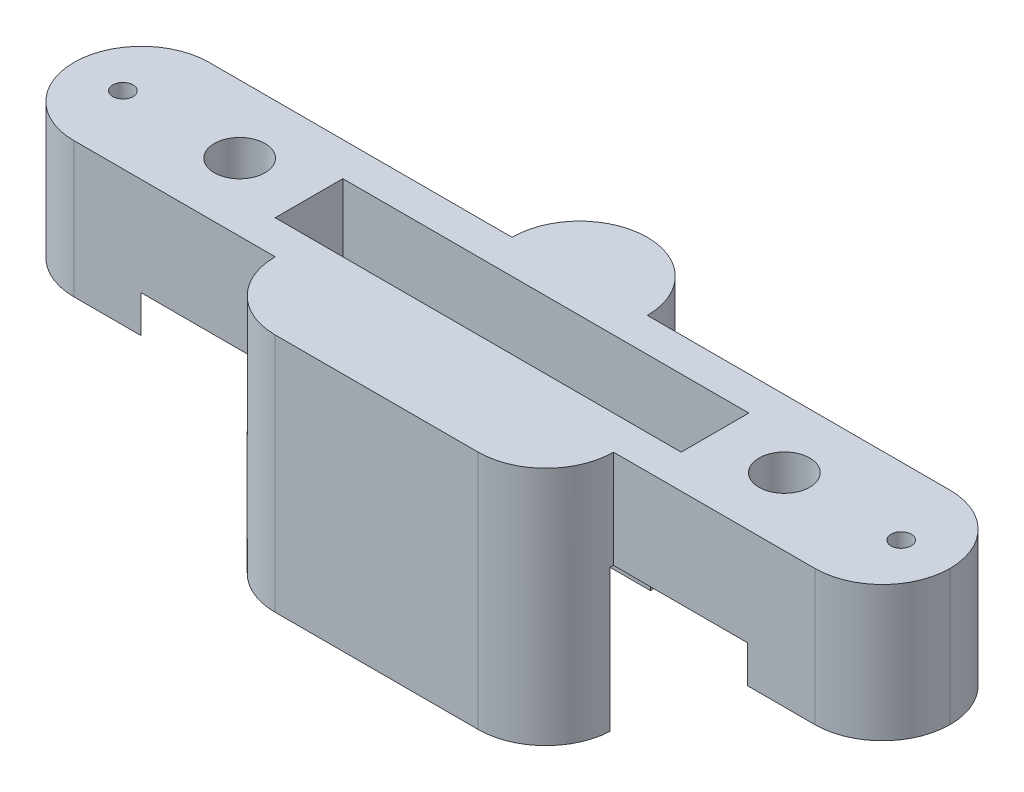
ISO-10303-21;
HEADER;
FILE_DESCRIPTION(('STEP AP214'),'2;1');
FILE_NAME('part.step','',(''),(''),'','','');
FILE_SCHEMA(('AUTOMOTIVE_DESIGN { 1 0 10303 214 1 1 1 1 }'));
ENDSEC;
DATA;
#1=APPLICATION_CONTEXT('core data for automotive mechanical design processes');
#2=APPLICATION_PROTOCOL_DEFINITION('international standard','automotive_design',2000,#1);
#3=PRODUCT_CONTEXT('',#1,'mechanical');
#4=PRODUCT('Part','Part','',(#3));
#5=PRODUCT_RELATED_PRODUCT_CATEGORY('part','',(#4));
#6=PRODUCT_DEFINITION_FORMATION('','',#4);
#7=PRODUCT_DEFINITION_CONTEXT('part definition',#1,'design');
#8=PRODUCT_DEFINITION('design','',#6,#7);
#9=PRODUCT_DEFINITION_SHAPE('','',#8);
#10=(LENGTH_UNIT() NAMED_UNIT(*) SI_UNIT(.MILLI.,.METRE.));
#11=(NAMED_UNIT(*) PLANE_ANGLE_UNIT() SI_UNIT($,.RADIAN.));
#12=(NAMED_UNIT(*) SI_UNIT($,.STERADIAN.) SOLID_ANGLE_UNIT());
#13=UNCERTAINTY_MEASURE_WITH_UNIT(LENGTH_MEASURE(1.E-05),#10,'distance_accuracy_value','');
#14=(GEOMETRIC_REPRESENTATION_CONTEXT(3) GLOBAL_UNCERTAINTY_ASSIGNED_CONTEXT((#13)) GLOBAL_UNIT_ASSIGNED_CONTEXT((#10,
#11,#12)) REPRESENTATION_CONTEXT('',''));
#15=CARTESIAN_POINT('',(0.,0.,0.));
#16=DIRECTION('',(0.,0.,1.));
#17=DIRECTION('',(1.,0.,0.));
#18=AXIS2_PLACEMENT_3D('',#15,#16,#17);
#19=CARTESIAN_POINT('',(-10.05,2.1,-2.));
#20=DIRECTION('',(0.,0.,-1.));
#21=DIRECTION('',(-1.,0.,0.));
#22=AXIS2_PLACEMENT_3D('',#19,#20,#21);
#23=PLANE('',#22);
#24=DIRECTION('',(0.,-1.,0.));
#25=VECTOR('',#24,1.);
#26=CARTESIAN_POINT('',(-2.,10.1980390271856,-2.));
#27=LINE('',#26,#25);
#28=CARTESIAN_POINT('',(-2.,0.,-2.));
#29=VERTEX_POINT('',#28);
#30=CARTESIAN_POINT('',(-2.,-2.9,-2.));
#31=VERTEX_POINT('',#30);
#32=EDGE_CURVE('E280',#29,#31,#27,.T.);
#33=ORIENTED_EDGE('',*,*,#32,.T.);
#34=DIRECTION('',(1.,0.,0.));
#35=VECTOR('',#34,1.);
#36=CARTESIAN_POINT('',(-8.05,-2.9,-2.));
#37=LINE('',#36,#35);
#38=CARTESIAN_POINT('',(-8.96651513899117,-2.9,-2.));
#39=VERTEX_POINT('',#38);
#40=EDGE_CURVE('E322',#39,#31,#37,.T.);
#41=ORIENTED_EDGE('',*,*,#40,.F.);
#42=DIRECTION('',(0.,-1.,0.));
#43=VECTOR('',#42,1.);
#44=CARTESIAN_POINT('',(-8.96651513899117,3.32253967444162,-2.));
#45=LINE('',#44,#43);
#46=CARTESIAN_POINT('',(-8.96651513899117,-4.,-2.));
#47=VERTEX_POINT('',#46);
#48=EDGE_CURVE('E302',#47,#39,#45,.F.);
#49=ORIENTED_EDGE('',*,*,#48,.F.);
#50=DIRECTION('',(1.,0.,0.));
#51=VECTOR('',#50,1.);
#52=CARTESIAN_POINT('',(-12.95,-4.,-2.));
#53=LINE('',#52,#51);
#54=CARTESIAN_POINT('',(-10.95,-4.,-2.));
#55=VERTEX_POINT('',#54);
#56=EDGE_CURVE('E340',#55,#47,#53,.T.);
#57=ORIENTED_EDGE('',*,*,#56,.F.);
#58=DIRECTION('',(0.,1.,0.));
#59=VECTOR('',#58,1.);
#60=CARTESIAN_POINT('',(-10.95,0.,-2.));
#61=LINE('',#60,#59);
#62=CARTESIAN_POINT('',(-10.95,0.,-2.));
#63=VERTEX_POINT('',#62);
#64=EDGE_CURVE('E367',#55,#63,#61,.T.);
#65=ORIENTED_EDGE('',*,*,#64,.T.);
#66=DIRECTION('',(1.,0.,0.));
#67=VECTOR('',#66,1.);
#68=CARTESIAN_POINT('',(-12.95,0.,-2.));
#69=LINE('',#68,#67);
#70=EDGE_CURVE('E349',#63,#29,#69,.T.);
#71=ORIENTED_EDGE('',*,*,#70,.T.);
#72=EDGE_LOOP('',(#33,#41,#49,#57,#65,#71));
#73=FACE_BOUND('',#72,.T.);
#74=ADVANCED_FACE('F41',(#73),#23,.T.);
#75=CARTESIAN_POINT('',(-10.05,2.1,2.));
#76=DIRECTION('',(0.,0.,-1.));
#77=DIRECTION('',(-1.,0.,0.));
#78=AXIS2_PLACEMENT_3D('',#75,#76,#77);
#79=PLANE('',#78);
#80=DIRECTION('',(-1.,0.,0.));
#81=VECTOR('',#80,1.);
#82=CARTESIAN_POINT('',(8.05,-2.9,2.));
#83=LINE('',#82,#81);
#84=CARTESIAN_POINT('',(-5.,-2.9,2.));
#85=VERTEX_POINT('',#84);
#86=CARTESIAN_POINT('',(-8.96651513899117,-2.9,2.));
#87=VERTEX_POINT('',#86);
#88=EDGE_CURVE('E321',#85,#87,#83,.T.);
#89=ORIENTED_EDGE('',*,*,#88,.F.);
#90=DIRECTION('',(0.,-1.,0.));
#91=VECTOR('',#90,1.);
#92=CARTESIAN_POINT('',(-5.,10.1980390271856,2.));
#93=LINE('',#92,#91);
#94=CARTESIAN_POINT('',(-5.,0.,2.));
#95=VERTEX_POINT('',#94);
#96=EDGE_CURVE('E289',#95,#85,#93,.T.);
#97=ORIENTED_EDGE('',*,*,#96,.F.);
#98=DIRECTION('',(1.,0.,0.));
#99=VECTOR('',#98,1.);
#100=CARTESIAN_POINT('',(-12.95,0.,2.));
#101=LINE('',#100,#99);
#102=CARTESIAN_POINT('',(-10.95,0.,2.));
#103=VERTEX_POINT('',#102);
#104=EDGE_CURVE('E344',#103,#95,#101,.T.);
#105=ORIENTED_EDGE('',*,*,#104,.F.);
#106=DIRECTION('',(0.,1.,0.));
#107=VECTOR('',#106,1.);
#108=CARTESIAN_POINT('',(-10.95,2.1,2.));
#109=LINE('',#108,#107);
#110=CARTESIAN_POINT('',(-10.95,-4.,2.));
#111=VERTEX_POINT('',#110);
#112=EDGE_CURVE('E343',#103,#111,#109,.F.);
#113=ORIENTED_EDGE('',*,*,#112,.T.);
#114=DIRECTION('',(1.,0.,0.));
#115=VECTOR('',#114,1.);
#116=CARTESIAN_POINT('',(-12.95,-4.,2.));
#117=LINE('',#116,#115);
#118=CARTESIAN_POINT('',(-8.96651513899117,-4.,2.));
#119=VERTEX_POINT('',#118);
#120=EDGE_CURVE('E335',#111,#119,#117,.T.);
#121=ORIENTED_EDGE('',*,*,#120,.T.);
#122=DIRECTION('',(0.,-1.,0.));
#123=VECTOR('',#122,1.);
#124=CARTESIAN_POINT('',(-8.96651513899117,3.32253967444162,2.));
#125=LINE('',#124,#123);
#126=EDGE_CURVE('E308',#119,#87,#125,.F.);
#127=ORIENTED_EDGE('',*,*,#126,.T.);
#128=EDGE_LOOP('',(#89,#97,#105,#113,#121,#127));
#129=FACE_BOUND('',#128,.T.);
#130=ADVANCED_FACE('F464',(#129),#79,.F.);
#131=CARTESIAN_POINT('',(5.,0.,2.));
#132=VERTEX_POINT('',#131);
#133=CARTESIAN_POINT('',(10.95,0.,2.));
#134=VERTEX_POINT('',#133);
#135=EDGE_CURVE('E348',#132,#134,#101,.T.);
#136=ORIENTED_EDGE('',*,*,#135,.F.);
#137=DIRECTION('',(0.,-1.,0.));
#138=VECTOR('',#137,1.);
#139=CARTESIAN_POINT('',(5.,10.1980390271856,2.));
#140=LINE('',#139,#138);
#141=CARTESIAN_POINT('',(5.,-2.9,2.));
#142=VERTEX_POINT('',#141);
#143=EDGE_CURVE('E290',#132,#142,#140,.T.);
#144=ORIENTED_EDGE('',*,*,#143,.T.);
#145=CARTESIAN_POINT('',(8.96651513899117,-2.9,2.));
#146=VERTEX_POINT('',#145);
#147=EDGE_CURVE('E317',#146,#142,#83,.T.);
#148=ORIENTED_EDGE('',*,*,#147,.F.);
#149=DIRECTION('',(0.,-1.,0.));
#150=VECTOR('',#149,1.);
#151=CARTESIAN_POINT('',(8.96651513899117,3.32253967444162,2.));
#152=LINE('',#151,#150);
#153=CARTESIAN_POINT('',(8.96651513899117,-4.,2.));
#154=VERTEX_POINT('',#153);
#155=EDGE_CURVE('E313',#146,#154,#152,.T.);
#156=ORIENTED_EDGE('',*,*,#155,.T.);
#157=CARTESIAN_POINT('',(10.95,-4.,2.));
#158=VERTEX_POINT('',#157);
#159=EDGE_CURVE('E339',#154,#158,#117,.T.);
#160=ORIENTED_EDGE('',*,*,#159,.T.);
#161=DIRECTION('',(0.,1.,0.));
#162=VECTOR('',#161,1.);
#163=CARTESIAN_POINT('',(10.95,0.,2.));
#164=LINE('',#163,#162);
#165=EDGE_CURVE('E354',#158,#134,#164,.T.);
#166=ORIENTED_EDGE('',*,*,#165,.T.);
#167=EDGE_LOOP('',(#136,#144,#148,#156,#160,#166));
#168=FACE_BOUND('',#167,.T.);
#169=ADVANCED_FACE('F522',(#168),#79,.F.);
#170=DIRECTION('',(0.,-1.,0.));
#171=VECTOR('',#170,1.);
#172=CARTESIAN_POINT('',(2.,10.1980390271856,-2.));
#173=LINE('',#172,#171);
#174=CARTESIAN_POINT('',(2.,0.,-2.));
#175=VERTEX_POINT('',#174);
#176=CARTESIAN_POINT('',(2.,-2.9,-2.));
#177=VERTEX_POINT('',#176);
#178=EDGE_CURVE('E277',#175,#177,#173,.T.);
#179=ORIENTED_EDGE('',*,*,#178,.F.);
#180=CARTESIAN_POINT('',(10.95,0.,-2.));
#181=VERTEX_POINT('',#180);
#182=EDGE_CURVE('E347',#175,#181,#69,.T.);
#183=ORIENTED_EDGE('',*,*,#182,.T.);
#184=DIRECTION('',(0.,1.,0.));
#185=VECTOR('',#184,1.);
#186=CARTESIAN_POINT('',(10.95,2.1,-2.));
#187=LINE('',#186,#185);
#188=CARTESIAN_POINT('',(10.95,-4.,-2.));
#189=VERTEX_POINT('',#188);
#190=EDGE_CURVE('E370',#181,#189,#187,.F.);
#191=ORIENTED_EDGE('',*,*,#190,.T.);
#192=CARTESIAN_POINT('',(8.96651513899117,-4.,-2.));
#193=VERTEX_POINT('',#192);
#194=EDGE_CURVE('E338',#193,#189,#53,.T.);
#195=ORIENTED_EDGE('',*,*,#194,.F.);
#196=DIRECTION('',(0.,-1.,0.));
#197=VECTOR('',#196,1.);
#198=CARTESIAN_POINT('',(8.96651513899117,3.32253967444162,-2.));
#199=LINE('',#198,#197);
#200=CARTESIAN_POINT('',(8.96651513899117,-2.9,-2.));
#201=VERTEX_POINT('',#200);
#202=EDGE_CURVE('E311',#201,#193,#199,.T.);
#203=ORIENTED_EDGE('',*,*,#202,.F.);
#204=EDGE_CURVE('E316',#177,#201,#37,.T.);
#205=ORIENTED_EDGE('',*,*,#204,.F.);
#206=EDGE_LOOP('',(#179,#183,#191,#195,#203,#205));
#207=FACE_BOUND('',#206,.T.);
#208=ADVANCED_FACE('F509',(#207),#23,.T.);
#209=CARTESIAN_POINT('',(0.,-4.,0.));
#210=DIRECTION('',(0.,1.,0.));
#211=DIRECTION('',(0.,0.,1.));
#212=AXIS2_PLACEMENT_3D('',#209,#210,#211);
#213=PLANE('',#212);
#214=CARTESIAN_POINT('',(-11.5,-4.,0.));
#215=DIRECTION('',(0.,-1.,0.));
#216=DIRECTION('',(0.,0.,-1.));
#217=AXIS2_PLACEMENT_3D('',#214,#215,#216);
#218=CIRCLE('',#217,0.3);
#219=CARTESIAN_POINT('',(-11.5,-4.,-0.3));
#220=VERTEX_POINT('',#219);
#221=EDGE_CURVE('E325',#220,#220,#218,.T.);
#222=ORIENTED_EDGE('',*,*,#221,.F.);
#223=EDGE_LOOP('',(#222));
#224=FACE_BOUND('',#223,.T.);
#225=ORIENTED_EDGE('',*,*,#56,.T.);
#226=CARTESIAN_POINT('',(-8.05,-4.,0.));
#227=DIRECTION('',(0.,-1.,0.));
#228=DIRECTION('',(0.,0.,-1.));
#229=AXIS2_PLACEMENT_3D('',#226,#227,#228);
#230=CIRCLE('',#229,2.2);
#231=EDGE_CURVE('E299',#119,#47,#230,.T.);
#232=ORIENTED_EDGE('',*,*,#231,.F.);
#233=ORIENTED_EDGE('',*,*,#120,.F.);
#234=CARTESIAN_POINT('',(-10.95,-4.,0.));
#235=DIRECTION('',(0.,1.,0.));
#236=DIRECTION('',(0.,0.,1.));
#237=AXIS2_PLACEMENT_3D('',#234,#235,#236);
#238=CIRCLE('',#237,2.);
#239=CARTESIAN_POINT('',(-12.95,-4.,0.));
#240=VERTEX_POINT('',#239);
#241=EDGE_CURVE('E380',#111,#240,#238,.F.);
#242=ORIENTED_EDGE('',*,*,#241,.T.);
#243=CARTESIAN_POINT('',(-10.95,-4.,0.));
#244=DIRECTION('',(0.,1.,0.));
#245=DIRECTION('',(0.,0.,1.));
#246=AXIS2_PLACEMENT_3D('',#243,#244,#245);
#247=CIRCLE('',#246,2.);
#248=EDGE_CURVE('E378',#240,#55,#247,.F.);
#249=ORIENTED_EDGE('',*,*,#248,.T.);
#250=EDGE_LOOP('',(#225,#232,#233,#242,#249));
#251=FACE_BOUND('',#250,.T.);
#252=ADVANCED_FACE('F477',(#224,#251),#213,.F.);
#253=CARTESIAN_POINT('',(0.,0.,0.));
#254=DIRECTION('',(0.,1.,0.));
#255=DIRECTION('',(0.,0.,1.));
#256=AXIS2_PLACEMENT_3D('',#253,#254,#255);
#257=PLANE('',#256);
#258=DIRECTION('',(0.,0.,-1.));
#259=VECTOR('',#258,1.);
#260=CARTESIAN_POINT('',(-6.,0.,1.));
#261=LINE('',#260,#259);
#262=CARTESIAN_POINT('',(-6.,0.,1.));
#263=VERTEX_POINT('',#262);
#264=CARTESIAN_POINT('',(-6.,0.,-1.));
#265=VERTEX_POINT('',#264);
#266=EDGE_CURVE('E211',#263,#265,#261,.T.);
#267=ORIENTED_EDGE('',*,*,#266,.T.);
#268=DIRECTION('',(1.,0.,0.));
#269=VECTOR('',#268,1.);
#270=CARTESIAN_POINT('',(-6.,0.,-1.));
#271=LINE('',#270,#269);
#272=CARTESIAN_POINT('',(6.,0.,-1.));
#273=VERTEX_POINT('',#272);
#274=EDGE_CURVE('E220',#265,#273,#271,.T.);
#275=ORIENTED_EDGE('',*,*,#274,.T.);
#276=DIRECTION('',(0.,0.,1.));
#277=VECTOR('',#276,1.);
#278=CARTESIAN_POINT('',(6.,0.,1.));
#279=LINE('',#278,#277);
#280=CARTESIAN_POINT('',(6.,0.,1.));
#281=VERTEX_POINT('',#280);
#282=EDGE_CURVE('E58',#273,#281,#279,.T.);
#283=ORIENTED_EDGE('',*,*,#282,.T.);
#284=DIRECTION('',(-1.,0.,0.));
#285=VECTOR('',#284,1.);
#286=CARTESIAN_POINT('',(-6.,0.,1.));
#287=LINE('',#286,#285);
#288=EDGE_CURVE('E217',#281,#263,#287,.T.);
#289=ORIENTED_EDGE('',*,*,#288,.T.);
#290=EDGE_LOOP('',(#267,#275,#283,#289));
#291=FACE_BOUND('',#290,.T.);
#292=CARTESIAN_POINT('',(-8.05,0.,0.));
#293=DIRECTION('',(0.,-1.,0.));
#294=DIRECTION('',(0.,0.,-1.));
#295=AXIS2_PLACEMENT_3D('',#292,#293,#294);
#296=CIRCLE('',#295,0.75);
#297=CARTESIAN_POINT('',(-8.05,0.,-0.75));
#298=VERTEX_POINT('',#297);
#299=EDGE_CURVE('E246',#298,#298,#296,.T.);
#300=ORIENTED_EDGE('',*,*,#299,.T.);
#301=EDGE_LOOP('',(#300));
#302=FACE_BOUND('',#301,.T.);
#303=CARTESIAN_POINT('',(8.05,0.,0.));
#304=DIRECTION('',(0.,-1.,0.));
#305=DIRECTION('',(0.,0.,-1.));
#306=AXIS2_PLACEMENT_3D('',#303,#304,#305);
#307=CIRCLE('',#306,0.75);
#308=CARTESIAN_POINT('',(8.05,0.,-0.750000000000001));
#309=VERTEX_POINT('',#308);
#310=EDGE_CURVE('E242',#309,#309,#307,.T.);
#311=ORIENTED_EDGE('',*,*,#310,.T.);
#312=EDGE_LOOP('',(#311));
#313=FACE_BOUND('',#312,.T.);
#314=ORIENTED_EDGE('',*,*,#104,.T.);
#315=CARTESIAN_POINT('',(-3.,0.,2.));
#316=DIRECTION('',(0.,1.,0.));
#317=DIRECTION('',(0.,0.,1.));
#318=AXIS2_PLACEMENT_3D('',#315,#316,#317);
#319=CIRCLE('',#318,2.);
#320=CARTESIAN_POINT('',(-3.,0.,4.));
#321=VERTEX_POINT('',#320);
#322=EDGE_CURVE('E12',#95,#321,#319,.T.);
#323=ORIENTED_EDGE('',*,*,#322,.T.);
#324=DIRECTION('',(-1.,0.,0.));
#325=VECTOR('',#324,1.);
#326=CARTESIAN_POINT('',(5.,0.,4.));
#327=LINE('',#326,#325);
#328=CARTESIAN_POINT('',(3.,0.,4.));
#329=VERTEX_POINT('',#328);
#330=EDGE_CURVE('E286',#329,#321,#327,.T.);
#331=ORIENTED_EDGE('',*,*,#330,.F.);
#332=CARTESIAN_POINT('',(3.,0.,2.));
#333=DIRECTION('',(0.,1.,0.));
#334=DIRECTION('',(0.,0.,1.));
#335=AXIS2_PLACEMENT_3D('',#332,#333,#334);
#336=CIRCLE('',#335,2.);
#337=EDGE_CURVE('E50',#329,#132,#336,.T.);
#338=ORIENTED_EDGE('',*,*,#337,.T.);
#339=ORIENTED_EDGE('',*,*,#135,.T.);
#340=CARTESIAN_POINT('',(10.95,0.,0.));
#341=DIRECTION('',(0.,1.,0.));
#342=DIRECTION('',(0.,0.,1.));
#343=AXIS2_PLACEMENT_3D('',#340,#341,#342);
#344=CIRCLE('',#343,2.);
#345=CARTESIAN_POINT('',(12.95,0.,0.));
#346=VERTEX_POINT('',#345);
#347=EDGE_CURVE('E360',#134,#346,#344,.T.);
#348=ORIENTED_EDGE('',*,*,#347,.T.);
#349=CARTESIAN_POINT('',(10.95,0.,0.));
#350=DIRECTION('',(0.,1.,0.));
#351=DIRECTION('',(0.,0.,1.));
#352=AXIS2_PLACEMENT_3D('',#349,#350,#351);
#353=CIRCLE('',#352,2.);
#354=EDGE_CURVE('E357',#346,#181,#353,.T.);
#355=ORIENTED_EDGE('',*,*,#354,.T.);
#356=ORIENTED_EDGE('',*,*,#182,.F.);
#357=CARTESIAN_POINT('',(0.,0.,-2.));
#358=DIRECTION('',(0.,1.,0.));
#359=DIRECTION('',(0.,0.,1.));
#360=AXIS2_PLACEMENT_3D('',#357,#358,#359);
#361=CIRCLE('',#360,2.);
#362=CARTESIAN_POINT('',(0.,0.,-4.));
#363=VERTEX_POINT('',#362);
#364=EDGE_CURVE('E401',#175,#363,#361,.T.);
#365=ORIENTED_EDGE('',*,*,#364,.T.);
#366=CARTESIAN_POINT('',(0.,0.,-2.));
#367=DIRECTION('',(0.,1.,0.));
#368=DIRECTION('',(0.,0.,1.));
#369=AXIS2_PLACEMENT_3D('',#366,#367,#368);
#370=CIRCLE('',#369,2.);
#371=EDGE_CURVE('E403',#363,#29,#370,.T.);
#372=ORIENTED_EDGE('',*,*,#371,.T.);
#373=ORIENTED_EDGE('',*,*,#70,.F.);
#374=CARTESIAN_POINT('',(-10.95,0.,0.));
#375=DIRECTION('',(0.,1.,0.));
#376=DIRECTION('',(0.,0.,1.));
#377=AXIS2_PLACEMENT_3D('',#374,#375,#376);
#378=CIRCLE('',#377,2.);
#379=CARTESIAN_POINT('',(-12.95,0.,0.));
#380=VERTEX_POINT('',#379);
#381=EDGE_CURVE('E373',#63,#380,#378,.T.);
#382=ORIENTED_EDGE('',*,*,#381,.T.);
#383=CARTESIAN_POINT('',(-10.95,0.,0.));
#384=DIRECTION('',(0.,1.,0.));
#385=DIRECTION('',(0.,0.,1.));
#386=AXIS2_PLACEMENT_3D('',#383,#384,#385);
#387=CIRCLE('',#386,2.);
#388=EDGE_CURVE('E375',#380,#103,#387,.T.);
#389=ORIENTED_EDGE('',*,*,#388,.T.);
#390=EDGE_LOOP('',(#314,#323,#331,#338,#339,#348,#355,#356,#365,#372,#373,#382,#389));
#391=FACE_BOUND('',#390,.T.);
#392=CARTESIAN_POINT('',(11.5,0.,0.));
#393=DIRECTION('',(0.,1.,0.));
#394=DIRECTION('',(0.,0.,1.));
#395=AXIS2_PLACEMENT_3D('',#392,#393,#394);
#396=CIRCLE('',#395,0.3);
#397=CARTESIAN_POINT('',(11.5,0.,0.3));
#398=VERTEX_POINT('',#397);
#399=EDGE_CURVE('E331',#398,#398,#396,.T.);
#400=ORIENTED_EDGE('',*,*,#399,.F.);
#401=EDGE_LOOP('',(#400));
#402=FACE_BOUND('',#401,.T.);
#403=CARTESIAN_POINT('',(-11.5,0.,0.));
#404=DIRECTION('',(0.,1.,0.));
#405=DIRECTION('',(0.,0.,1.));
#406=AXIS2_PLACEMENT_3D('',#403,#404,#405);
#407=CIRCLE('',#406,0.3);
#408=CARTESIAN_POINT('',(-11.5,0.,0.3));
#409=VERTEX_POINT('',#408);
#410=EDGE_CURVE('E328',#409,#409,#407,.T.);
#411=ORIENTED_EDGE('',*,*,#410,.F.);
#412=EDGE_LOOP('',(#411));
#413=FACE_BOUND('',#412,.T.);
#414=ADVANCED_FACE('F224',(#291,#302,#313,#391,#402,#413),#257,.T.);
#415=CARTESIAN_POINT('',(11.5,-4.,0.));
#416=DIRECTION('',(0.,-1.,0.));
#417=DIRECTION('',(0.,0.,-1.));
#418=AXIS2_PLACEMENT_3D('',#415,#416,#417);
#419=CIRCLE('',#418,0.3);
#420=CARTESIAN_POINT('',(11.5,-4.,-0.3));
#421=VERTEX_POINT('',#420);
#422=EDGE_CURVE('E320',#421,#421,#419,.T.);
#423=ORIENTED_EDGE('',*,*,#422,.F.);
#424=EDGE_LOOP('',(#423));
#425=FACE_BOUND('',#424,.T.);
#426=ORIENTED_EDGE('',*,*,#159,.F.);
#427=CARTESIAN_POINT('',(8.05,-4.,0.));
#428=DIRECTION('',(0.,-1.,0.));
#429=DIRECTION('',(0.,0.,-1.));
#430=AXIS2_PLACEMENT_3D('',#427,#428,#429);
#431=CIRCLE('',#430,2.2);
#432=EDGE_CURVE('E296',#193,#154,#431,.T.);
#433=ORIENTED_EDGE('',*,*,#432,.F.);
#434=ORIENTED_EDGE('',*,*,#194,.T.);
#435=CARTESIAN_POINT('',(10.95,-4.,0.));
#436=DIRECTION('',(0.,1.,0.));
#437=DIRECTION('',(0.,0.,1.));
#438=AXIS2_PLACEMENT_3D('',#435,#436,#437);
#439=CIRCLE('',#438,2.);
#440=CARTESIAN_POINT('',(12.95,-4.,0.));
#441=VERTEX_POINT('',#440);
#442=EDGE_CURVE('E362',#189,#441,#439,.F.);
#443=ORIENTED_EDGE('',*,*,#442,.T.);
#444=CARTESIAN_POINT('',(10.95,-4.,0.));
#445=DIRECTION('',(0.,1.,0.));
#446=DIRECTION('',(0.,0.,1.));
#447=AXIS2_PLACEMENT_3D('',#444,#445,#446);
#448=CIRCLE('',#447,2.);
#449=EDGE_CURVE('E364',#441,#158,#448,.F.);
#450=ORIENTED_EDGE('',*,*,#449,.T.);
#451=EDGE_LOOP('',(#426,#433,#434,#443,#450));
#452=FACE_BOUND('',#451,.T.);
#453=ADVANCED_FACE('F517',(#425,#452),#213,.F.);
#454=CARTESIAN_POINT('',(10.95,-4.,0.));
#455=DIRECTION('',(0.,1.,0.));
#456=DIRECTION('',(0.,0.,1.));
#457=AXIS2_PLACEMENT_3D('',#454,#455,#456);
#458=CYLINDRICAL_SURFACE('',#457,2.);
#459=DIRECTION('',(0.,1.,0.));
#460=VECTOR('',#459,1.);
#461=CARTESIAN_POINT('',(12.95,-4.,0.));
#462=LINE('',#461,#460);
#463=EDGE_CURVE('E383',#441,#346,#462,.T.);
#464=ORIENTED_EDGE('',*,*,#463,.F.);
#465=ORIENTED_EDGE('',*,*,#442,.F.);
#466=ORIENTED_EDGE('',*,*,#190,.F.);
#467=ORIENTED_EDGE('',*,*,#354,.F.);
#468=EDGE_LOOP('',(#464,#465,#466,#467));
#469=FACE_BOUND('',#468,.T.);
#470=ADVANCED_FACE('F542',(#469),#458,.T.);
#471=CARTESIAN_POINT('',(10.95,2.1,0.));
#472=DIRECTION('',(0.,-1.,0.));
#473=DIRECTION('',(0.,0.,-1.));
#474=AXIS2_PLACEMENT_3D('',#471,#472,#473);
#475=CYLINDRICAL_SURFACE('',#474,2.);
#476=ORIENTED_EDGE('',*,*,#449,.F.);
#477=ORIENTED_EDGE('',*,*,#463,.T.);
#478=ORIENTED_EDGE('',*,*,#347,.F.);
#479=ORIENTED_EDGE('',*,*,#165,.F.);
#480=EDGE_LOOP('',(#476,#477,#478,#479));
#481=FACE_BOUND('',#480,.T.);
#482=ADVANCED_FACE('F538',(#481),#475,.T.);
#483=CARTESIAN_POINT('',(-10.95,2.1,0.));
#484=DIRECTION('',(0.,-1.,0.));
#485=DIRECTION('',(0.,0.,-1.));
#486=AXIS2_PLACEMENT_3D('',#483,#484,#485);
#487=CYLINDRICAL_SURFACE('',#486,2.);
#488=ORIENTED_EDGE('',*,*,#64,.F.);
#489=ORIENTED_EDGE('',*,*,#248,.F.);
#490=DIRECTION('',(0.,1.,0.));
#491=VECTOR('',#490,1.);
#492=CARTESIAN_POINT('',(-12.95,-4.,0.));
#493=LINE('',#492,#491);
#494=EDGE_CURVE('E334',#380,#240,#493,.F.);
#495=ORIENTED_EDGE('',*,*,#494,.F.);
#496=ORIENTED_EDGE('',*,*,#381,.F.);
#497=EDGE_LOOP('',(#488,#489,#495,#496));
#498=FACE_BOUND('',#497,.T.);
#499=ADVANCED_FACE('F545',(#498),#487,.T.);
#500=CARTESIAN_POINT('',(-10.95,-4.,0.));
#501=DIRECTION('',(0.,1.,0.));
#502=DIRECTION('',(0.,0.,1.));
#503=AXIS2_PLACEMENT_3D('',#500,#501,#502);
#504=CYLINDRICAL_SURFACE('',#503,2.);
#505=ORIENTED_EDGE('',*,*,#241,.F.);
#506=ORIENTED_EDGE('',*,*,#112,.F.);
#507=ORIENTED_EDGE('',*,*,#388,.F.);
#508=ORIENTED_EDGE('',*,*,#494,.T.);
#509=EDGE_LOOP('',(#505,#506,#507,#508));
#510=FACE_BOUND('',#509,.T.);
#511=ADVANCED_FACE('F473',(#510),#504,.T.);
#512=CARTESIAN_POINT('',(-11.5,2.1,0.));
#513=DIRECTION('',(0.,-1.,0.));
#514=DIRECTION('',(0.,0.,-1.));
#515=AXIS2_PLACEMENT_3D('',#512,#513,#514);
#516=CYLINDRICAL_SURFACE('',#515,0.3);
#517=ORIENTED_EDGE('',*,*,#410,.T.);
#518=EDGE_LOOP('',(#517));
#519=FACE_BOUND('',#518,.T.);
#520=ORIENTED_EDGE('',*,*,#221,.T.);
#521=EDGE_LOOP('',(#520));
#522=FACE_BOUND('',#521,.T.);
#523=ADVANCED_FACE('F552',(#519,#522),#516,.F.);
#524=CARTESIAN_POINT('',(11.5,2.1,0.));
#525=DIRECTION('',(0.,-1.,0.));
#526=DIRECTION('',(0.,0.,-1.));
#527=AXIS2_PLACEMENT_3D('',#524,#525,#526);
#528=CYLINDRICAL_SURFACE('',#527,0.3);
#529=ORIENTED_EDGE('',*,*,#399,.T.);
#530=EDGE_LOOP('',(#529));
#531=FACE_BOUND('',#530,.T.);
#532=ORIENTED_EDGE('',*,*,#422,.T.);
#533=EDGE_LOOP('',(#532));
#534=FACE_BOUND('',#533,.T.);
#535=ADVANCED_FACE('F450',(#531,#534),#528,.F.);
#536=CARTESIAN_POINT('',(0.,-2.9,0.));
#537=DIRECTION('',(0.,1.,0.));
#538=DIRECTION('',(0.,0.,1.));
#539=AXIS2_PLACEMENT_3D('',#536,#537,#538);
#540=PLANE('',#539);
#541=DIRECTION('',(1.,0.,0.));
#542=VECTOR('',#541,1.);
#543=CARTESIAN_POINT('',(-6.,-2.9,-1.));
#544=LINE('',#543,#542);
#545=CARTESIAN_POINT('',(-6.,-2.9,-1.));
#546=VERTEX_POINT('',#545);
#547=CARTESIAN_POINT('',(6.,-2.9,-1.));
#548=VERTEX_POINT('',#547);
#549=EDGE_CURVE('E236',#546,#548,#544,.T.);
#550=ORIENTED_EDGE('',*,*,#549,.F.);
#551=DIRECTION('',(0.,0.,-1.));
#552=VECTOR('',#551,1.);
#553=CARTESIAN_POINT('',(-6.,-2.9,1.));
#554=LINE('',#553,#552);
#555=CARTESIAN_POINT('',(-6.,-2.9,1.));
#556=VERTEX_POINT('',#555);
#557=EDGE_CURVE('E66',#556,#546,#554,.T.);
#558=ORIENTED_EDGE('',*,*,#557,.F.);
#559=DIRECTION('',(-1.,0.,0.));
#560=VECTOR('',#559,1.);
#561=CARTESIAN_POINT('',(-6.,-2.9,1.));
#562=LINE('',#561,#560);
#563=CARTESIAN_POINT('',(6.,-2.9,1.));
#564=VERTEX_POINT('',#563);
#565=EDGE_CURVE('E227',#564,#556,#562,.T.);
#566=ORIENTED_EDGE('',*,*,#565,.F.);
#567=DIRECTION('',(0.,0.,1.));
#568=VECTOR('',#567,1.);
#569=CARTESIAN_POINT('',(6.,-2.9,1.));
#570=LINE('',#569,#568);
#571=EDGE_CURVE('E230',#548,#564,#570,.T.);
#572=ORIENTED_EDGE('',*,*,#571,.F.);
#573=EDGE_LOOP('',(#550,#558,#566,#572));
#574=FACE_BOUND('',#573,.T.);
#575=CARTESIAN_POINT('',(-8.05,-2.9,0.));
#576=DIRECTION('',(0.,-1.,0.));
#577=DIRECTION('',(0.,0.,-1.));
#578=AXIS2_PLACEMENT_3D('',#575,#576,#577);
#579=CIRCLE('',#578,1.25);
#580=CARTESIAN_POINT('',(-8.05,-2.9,-1.25));
#581=VERTEX_POINT('',#580);
#582=EDGE_CURVE('E256',#581,#581,#579,.T.);
#583=ORIENTED_EDGE('',*,*,#582,.F.);
#584=EDGE_LOOP('',(#583));
#585=FACE_BOUND('',#584,.T.);
#586=CARTESIAN_POINT('',(8.05,-2.9,0.));
#587=DIRECTION('',(0.,-1.,0.));
#588=DIRECTION('',(0.,0.,-1.));
#589=AXIS2_PLACEMENT_3D('',#586,#587,#588);
#590=CIRCLE('',#589,1.25);
#591=CARTESIAN_POINT('',(8.05,-2.9,-1.25));
#592=VERTEX_POINT('',#591);
#593=EDGE_CURVE('E259',#592,#592,#590,.T.);
#594=ORIENTED_EDGE('',*,*,#593,.F.);
#595=EDGE_LOOP('',(#594));
#596=FACE_BOUND('',#595,.T.);
#597=DIRECTION('',(-1.,0.,0.));
#598=VECTOR('',#597,1.);
#599=CARTESIAN_POINT('',(5.,-2.9,2.1));
#600=LINE('',#599,#598);
#601=CARTESIAN_POINT('',(4.99749843554382,-2.9,2.1));
#602=VERTEX_POINT('',#601);
#603=CARTESIAN_POINT('',(-4.99749843554382,-2.9,2.1));
#604=VERTEX_POINT('',#603);
#605=EDGE_CURVE('E268',#602,#604,#600,.T.);
#606=ORIENTED_EDGE('',*,*,#605,.T.);
#607=CARTESIAN_POINT('',(-3.,-2.9,2.));
#608=DIRECTION('',(0.,1.,0.));
#609=DIRECTION('',(0.,0.,1.));
#610=AXIS2_PLACEMENT_3D('',#607,#608,#609);
#611=CIRCLE('',#610,2.);
#612=EDGE_CURVE('E422',#604,#85,#611,.F.);
#613=ORIENTED_EDGE('',*,*,#612,.T.);
#614=ORIENTED_EDGE('',*,*,#88,.T.);
#615=CARTESIAN_POINT('',(-8.05,-2.9,0.));
#616=DIRECTION('',(0.,1.,0.));
#617=DIRECTION('',(0.,0.,1.));
#618=AXIS2_PLACEMENT_3D('',#615,#616,#617);
#619=CIRCLE('',#618,2.2);
#620=EDGE_CURVE('E293',#87,#39,#619,.F.);
#621=ORIENTED_EDGE('',*,*,#620,.T.);
#622=ORIENTED_EDGE('',*,*,#40,.T.);
#623=CARTESIAN_POINT('',(0.,-2.9,-2.));
#624=DIRECTION('',(0.,1.,0.));
#625=DIRECTION('',(0.,0.,1.));
#626=AXIS2_PLACEMENT_3D('',#623,#624,#625);
#627=CIRCLE('',#626,2.);
#628=CARTESIAN_POINT('',(-1.99749843554382,-2.9,-2.1));
#629=VERTEX_POINT('',#628);
#630=EDGE_CURVE('E391',#31,#629,#627,.F.);
#631=ORIENTED_EDGE('',*,*,#630,.T.);
#632=DIRECTION('',(1.,0.,0.));
#633=VECTOR('',#632,1.);
#634=CARTESIAN_POINT('',(5.,-2.9,-2.1));
#635=LINE('',#634,#633);
#636=CARTESIAN_POINT('',(1.99749843554382,-2.9,-2.1));
#637=VERTEX_POINT('',#636);
#638=EDGE_CURVE('E274',#629,#637,#635,.T.);
#639=ORIENTED_EDGE('',*,*,#638,.T.);
#640=CARTESIAN_POINT('',(0.,-2.9,-2.));
#641=DIRECTION('',(0.,1.,0.));
#642=DIRECTION('',(0.,0.,1.));
#643=AXIS2_PLACEMENT_3D('',#640,#641,#642);
#644=CIRCLE('',#643,2.);
#645=EDGE_CURVE('E382',#637,#177,#644,.F.);
#646=ORIENTED_EDGE('',*,*,#645,.T.);
#647=ORIENTED_EDGE('',*,*,#204,.T.);
#648=CARTESIAN_POINT('',(8.05,-2.9,0.));
#649=DIRECTION('',(0.,1.,0.));
#650=DIRECTION('',(0.,0.,1.));
#651=AXIS2_PLACEMENT_3D('',#648,#649,#650);
#652=CIRCLE('',#651,2.2);
#653=EDGE_CURVE('E298',#201,#146,#652,.F.);
#654=ORIENTED_EDGE('',*,*,#653,.T.);
#655=ORIENTED_EDGE('',*,*,#147,.T.);
#656=CARTESIAN_POINT('',(3.,-2.9,2.));
#657=DIRECTION('',(0.,1.,0.));
#658=DIRECTION('',(0.,0.,1.));
#659=AXIS2_PLACEMENT_3D('',#656,#657,#658);
#660=CIRCLE('',#659,2.);
#661=EDGE_CURVE('E420',#142,#602,#660,.F.);
#662=ORIENTED_EDGE('',*,*,#661,.T.);
#663=EDGE_LOOP('',(#606,#613,#614,#621,#622,#631,#639,#646,#647,#654,#655,#662));
#664=FACE_BOUND('',#663,.T.);
#665=ADVANCED_FACE('F446',(#574,#585,#596,#664),#540,.F.);
#666=CARTESIAN_POINT('',(8.05,3.32253967444162,0.));
#667=DIRECTION('',(0.,-1.,0.));
#668=DIRECTION('',(0.,0.,-1.));
#669=AXIS2_PLACEMENT_3D('',#666,#667,#668);
#670=CYLINDRICAL_SURFACE('',#669,2.2);
#671=ORIENTED_EDGE('',*,*,#653,.F.);
#672=ORIENTED_EDGE('',*,*,#202,.T.);
#673=ORIENTED_EDGE('',*,*,#432,.T.);
#674=ORIENTED_EDGE('',*,*,#155,.F.);
#675=EDGE_LOOP('',(#671,#672,#673,#674));
#676=FACE_BOUND('',#675,.T.);
#677=ADVANCED_FACE('F449',(#676),#670,.F.);
#678=CARTESIAN_POINT('',(-8.05,3.32253967444162,0.));
#679=DIRECTION('',(0.,-1.,0.));
#680=DIRECTION('',(0.,0.,-1.));
#681=AXIS2_PLACEMENT_3D('',#678,#679,#680);
#682=CYLINDRICAL_SURFACE('',#681,2.2);
#683=ORIENTED_EDGE('',*,*,#231,.T.);
#684=ORIENTED_EDGE('',*,*,#48,.T.);
#685=ORIENTED_EDGE('',*,*,#620,.F.);
#686=ORIENTED_EDGE('',*,*,#126,.F.);
#687=EDGE_LOOP('',(#683,#684,#685,#686));
#688=FACE_BOUND('',#687,.T.);
#689=ADVANCED_FACE('F482',(#688),#682,.F.);
#690=CARTESIAN_POINT('',(0.,-7.1,0.));
#691=DIRECTION('',(0.,-1.,0.));
#692=DIRECTION('',(0.,0.,-1.));
#693=AXIS2_PLACEMENT_3D('',#690,#691,#692);
#694=PLANE('',#693);
#695=DIRECTION('',(-1.,0.,0.));
#696=VECTOR('',#695,1.);
#697=CARTESIAN_POINT('',(5.,-7.1,4.));
#698=LINE('',#697,#696);
#699=CARTESIAN_POINT('',(3.,-7.1,4.));
#700=VERTEX_POINT('',#699);
#701=CARTESIAN_POINT('',(-3.,-7.1,4.));
#702=VERTEX_POINT('',#701);
#703=EDGE_CURVE('E283',#700,#702,#698,.T.);
#704=ORIENTED_EDGE('',*,*,#703,.T.);
#705=CARTESIAN_POINT('',(-3.,-7.1,2.));
#706=DIRECTION('',(0.,-1.,0.));
#707=DIRECTION('',(0.,0.,-1.));
#708=AXIS2_PLACEMENT_3D('',#705,#706,#707);
#709=CIRCLE('',#708,2.);
#710=CARTESIAN_POINT('',(-4.99749843554382,-7.1,2.1));
#711=VERTEX_POINT('',#710);
#712=EDGE_CURVE('E414',#702,#711,#709,.T.);
#713=ORIENTED_EDGE('',*,*,#712,.T.);
#714=DIRECTION('',(-1.,0.,0.));
#715=VECTOR('',#714,1.);
#716=CARTESIAN_POINT('',(5.,-7.1,2.1));
#717=LINE('',#716,#715);
#718=CARTESIAN_POINT('',(4.99749843554382,-7.1,2.1));
#719=VERTEX_POINT('',#718);
#720=EDGE_CURVE('E269',#719,#711,#717,.T.);
#721=ORIENTED_EDGE('',*,*,#720,.F.);
#722=CARTESIAN_POINT('',(3.,-7.1,2.));
#723=DIRECTION('',(0.,-1.,0.));
#724=DIRECTION('',(0.,0.,-1.));
#725=AXIS2_PLACEMENT_3D('',#722,#723,#724);
#726=CIRCLE('',#725,2.);
#727=EDGE_CURVE('E412',#719,#700,#726,.T.);
#728=ORIENTED_EDGE('',*,*,#727,.T.);
#729=EDGE_LOOP('',(#704,#713,#721,#728));
#730=FACE_BOUND('',#729,.T.);
#731=ADVANCED_FACE('F531',(#730),#694,.T.);
#732=CARTESIAN_POINT('',(5.,10.1980390271856,4.));
#733=DIRECTION('',(0.,0.,1.));
#734=DIRECTION('',(1.,0.,0.));
#735=AXIS2_PLACEMENT_3D('',#732,#733,#734);
#736=PLANE('',#735);
#737=ORIENTED_EDGE('',*,*,#330,.T.);
#738=DIRECTION('',(0.,-1.,0.));
#739=VECTOR('',#738,1.);
#740=CARTESIAN_POINT('',(-3.,10.1980390271856,4.));
#741=LINE('',#740,#739);
#742=EDGE_CURVE('E409',#321,#702,#741,.T.);
#743=ORIENTED_EDGE('',*,*,#742,.T.);
#744=ORIENTED_EDGE('',*,*,#703,.F.);
#745=DIRECTION('',(0.,-1.,0.));
#746=VECTOR('',#745,1.);
#747=CARTESIAN_POINT('',(3.,10.1980390271856,4.));
#748=LINE('',#747,#746);
#749=EDGE_CURVE('E405',#700,#329,#748,.F.);
#750=ORIENTED_EDGE('',*,*,#749,.T.);
#751=EDGE_LOOP('',(#737,#743,#744,#750));
#752=FACE_BOUND('',#751,.T.);
#753=ADVANCED_FACE('F534',(#752),#736,.T.);
#754=CARTESIAN_POINT('',(0.,-7.1,0.));
#755=DIRECTION('',(0.,1.,0.));
#756=DIRECTION('',(0.,0.,1.));
#757=AXIS2_PLACEMENT_3D('',#754,#755,#756);
#758=PLANE('',#757);
#759=DIRECTION('',(1.,0.,0.));
#760=VECTOR('',#759,1.);
#761=CARTESIAN_POINT('',(5.,-7.1,-2.1));
#762=LINE('',#761,#760);
#763=CARTESIAN_POINT('',(-1.99749843554382,-7.1,-2.1));
#764=VERTEX_POINT('',#763);
#765=CARTESIAN_POINT('',(1.99749843554382,-7.1,-2.1));
#766=VERTEX_POINT('',#765);
#767=EDGE_CURVE('E265',#764,#766,#762,.T.);
#768=ORIENTED_EDGE('',*,*,#767,.F.);
#769=CARTESIAN_POINT('',(0.,-7.1,-2.));
#770=DIRECTION('',(0.,1.,0.));
#771=DIRECTION('',(0.,0.,1.));
#772=AXIS2_PLACEMENT_3D('',#769,#770,#771);
#773=CIRCLE('',#772,2.);
#774=CARTESIAN_POINT('',(0.,-7.1,-4.));
#775=VERTEX_POINT('',#774);
#776=EDGE_CURVE('E399',#764,#775,#773,.F.);
#777=ORIENTED_EDGE('',*,*,#776,.T.);
#778=CARTESIAN_POINT('',(0.,-7.1,-2.));
#779=DIRECTION('',(0.,1.,0.));
#780=DIRECTION('',(0.,0.,1.));
#781=AXIS2_PLACEMENT_3D('',#778,#779,#780);
#782=CIRCLE('',#781,2.);
#783=EDGE_CURVE('E397',#775,#766,#782,.F.);
#784=ORIENTED_EDGE('',*,*,#783,.T.);
#785=EDGE_LOOP('',(#768,#777,#784));
#786=FACE_BOUND('',#785,.T.);
#787=ADVANCED_FACE('F501',(#786),#758,.F.);
#788=CARTESIAN_POINT('',(5.,7.946197490365,-2.1));
#789=DIRECTION('',(0.,0.,-1.));
#790=DIRECTION('',(-1.,0.,0.));
#791=AXIS2_PLACEMENT_3D('',#788,#789,#790);
#792=PLANE('',#791);
#793=ORIENTED_EDGE('',*,*,#638,.F.);
#794=DIRECTION('',(0.,-1.,0.));
#795=VECTOR('',#794,1.);
#796=CARTESIAN_POINT('',(-1.99749843554382,-2.9,-2.1));
#797=LINE('',#796,#795);
#798=EDGE_CURVE('E395',#629,#764,#797,.T.);
#799=ORIENTED_EDGE('',*,*,#798,.T.);
#800=ORIENTED_EDGE('',*,*,#767,.T.);
#801=DIRECTION('',(0.,-1.,0.));
#802=VECTOR('',#801,1.);
#803=CARTESIAN_POINT('',(1.99749843554382,-7.1,-2.1));
#804=LINE('',#803,#802);
#805=EDGE_CURVE('E393',#766,#637,#804,.F.);
#806=ORIENTED_EDGE('',*,*,#805,.T.);
#807=EDGE_LOOP('',(#793,#799,#800,#806));
#808=FACE_BOUND('',#807,.T.);
#809=ADVANCED_FACE('F492',(#808),#792,.F.);
#810=CARTESIAN_POINT('',(5.,7.946197490365,2.1));
#811=DIRECTION('',(0.,0.,1.));
#812=DIRECTION('',(1.,0.,0.));
#813=AXIS2_PLACEMENT_3D('',#810,#811,#812);
#814=PLANE('',#813);
#815=ORIENTED_EDGE('',*,*,#720,.T.);
#816=DIRECTION('',(0.,-1.,0.));
#817=VECTOR('',#816,1.);
#818=CARTESIAN_POINT('',(-4.99749843554382,-7.1,2.1));
#819=LINE('',#818,#817);
#820=EDGE_CURVE('E418',#711,#604,#819,.F.);
#821=ORIENTED_EDGE('',*,*,#820,.T.);
#822=ORIENTED_EDGE('',*,*,#605,.F.);
#823=DIRECTION('',(0.,-1.,0.));
#824=VECTOR('',#823,1.);
#825=CARTESIAN_POINT('',(4.99749843554382,-2.9,2.1));
#826=LINE('',#825,#824);
#827=EDGE_CURVE('E416',#602,#719,#826,.T.);
#828=ORIENTED_EDGE('',*,*,#827,.T.);
#829=EDGE_LOOP('',(#815,#821,#822,#828));
#830=FACE_BOUND('',#829,.T.);
#831=ADVANCED_FACE('F529',(#830),#814,.F.);
#832=CARTESIAN_POINT('',(0.,10.1980390271856,-2.));
#833=DIRECTION('',(0.,-1.,0.));
#834=DIRECTION('',(0.,0.,-1.));
#835=AXIS2_PLACEMENT_3D('',#832,#833,#834);
#836=CYLINDRICAL_SURFACE('',#835,2.);
#837=DIRECTION('',(0.,-1.,0.));
#838=VECTOR('',#837,1.);
#839=CARTESIAN_POINT('',(0.,10.1980390271856,-4.));
#840=LINE('',#839,#838);
#841=EDGE_CURVE('E255',#363,#775,#840,.T.);
#842=ORIENTED_EDGE('',*,*,#841,.F.);
#843=ORIENTED_EDGE('',*,*,#364,.F.);
#844=ORIENTED_EDGE('',*,*,#178,.T.);
#845=ORIENTED_EDGE('',*,*,#645,.F.);
#846=ORIENTED_EDGE('',*,*,#805,.F.);
#847=ORIENTED_EDGE('',*,*,#783,.F.);
#848=EDGE_LOOP('',(#842,#843,#844,#845,#846,#847));
#849=FACE_BOUND('',#848,.T.);
#850=ADVANCED_FACE('F503',(#849),#836,.T.);
#851=CARTESIAN_POINT('',(0.,10.1980390271856,-2.));
#852=DIRECTION('',(0.,-1.,0.));
#853=DIRECTION('',(0.,0.,-1.));
#854=AXIS2_PLACEMENT_3D('',#851,#852,#853);
#855=CYLINDRICAL_SURFACE('',#854,2.);
#856=ORIENTED_EDGE('',*,*,#371,.F.);
#857=ORIENTED_EDGE('',*,*,#841,.T.);
#858=ORIENTED_EDGE('',*,*,#776,.F.);
#859=ORIENTED_EDGE('',*,*,#798,.F.);
#860=ORIENTED_EDGE('',*,*,#630,.F.);
#861=ORIENTED_EDGE('',*,*,#32,.F.);
#862=EDGE_LOOP('',(#856,#857,#858,#859,#860,#861));
#863=FACE_BOUND('',#862,.T.);
#864=ADVANCED_FACE('F497',(#863),#855,.T.);
#865=CARTESIAN_POINT('',(-3.,10.1980390271856,2.));
#866=DIRECTION('',(0.,-1.,0.));
#867=DIRECTION('',(0.,0.,-1.));
#868=AXIS2_PLACEMENT_3D('',#865,#866,#867);
#869=CYLINDRICAL_SURFACE('',#868,2.);
#870=ORIENTED_EDGE('',*,*,#322,.F.);
#871=ORIENTED_EDGE('',*,*,#96,.T.);
#872=ORIENTED_EDGE('',*,*,#612,.F.);
#873=ORIENTED_EDGE('',*,*,#820,.F.);
#874=ORIENTED_EDGE('',*,*,#712,.F.);
#875=ORIENTED_EDGE('',*,*,#742,.F.);
#876=EDGE_LOOP('',(#870,#871,#872,#873,#874,#875));
#877=FACE_BOUND('',#876,.T.);
#878=ADVANCED_FACE('F461',(#877),#869,.T.);
#879=CARTESIAN_POINT('',(3.,10.1980390271856,2.));
#880=DIRECTION('',(0.,-1.,0.));
#881=DIRECTION('',(0.,0.,-1.));
#882=AXIS2_PLACEMENT_3D('',#879,#880,#881);
#883=CYLINDRICAL_SURFACE('',#882,2.);
#884=ORIENTED_EDGE('',*,*,#337,.F.);
#885=ORIENTED_EDGE('',*,*,#749,.F.);
#886=ORIENTED_EDGE('',*,*,#727,.F.);
#887=ORIENTED_EDGE('',*,*,#827,.F.);
#888=ORIENTED_EDGE('',*,*,#661,.F.);
#889=ORIENTED_EDGE('',*,*,#143,.F.);
#890=EDGE_LOOP('',(#884,#885,#886,#887,#888,#889));
#891=FACE_BOUND('',#890,.T.);
#892=ADVANCED_FACE('F43',(#891),#883,.T.);
#893=CARTESIAN_POINT('',(8.05,-1.4,0.));
#894=DIRECTION('',(0.,-1.,0.));
#895=DIRECTION('',(0.,0.,-1.));
#896=AXIS2_PLACEMENT_3D('',#893,#894,#895);
#897=CYLINDRICAL_SURFACE('',#896,1.25);
#898=CARTESIAN_POINT('',(8.05,-1.4,0.));
#899=DIRECTION('',(0.,-1.,0.));
#900=DIRECTION('',(0.,0.,-1.));
#901=AXIS2_PLACEMENT_3D('',#898,#899,#900);
#902=CIRCLE('',#901,1.25);
#903=CARTESIAN_POINT('',(8.05,-1.4,-1.25));
#904=VERTEX_POINT('',#903);
#905=EDGE_CURVE('E262',#904,#904,#902,.T.);
#906=ORIENTED_EDGE('',*,*,#905,.F.);
#907=EDGE_LOOP('',(#906));
#908=FACE_BOUND('',#907,.T.);
#909=ORIENTED_EDGE('',*,*,#593,.T.);
#910=EDGE_LOOP('',(#909));
#911=FACE_BOUND('',#910,.T.);
#912=ADVANCED_FACE('F437',(#908,#911),#897,.F.);
#913=CARTESIAN_POINT('',(8.05,-1.4,0.));
#914=DIRECTION('',(0.,-1.,0.));
#915=DIRECTION('',(0.,0.,-1.));
#916=AXIS2_PLACEMENT_3D('',#913,#914,#915);
#917=PLANE('',#916);
#918=CARTESIAN_POINT('',(8.05,-1.4,0.));
#919=DIRECTION('',(0.,-1.,0.));
#920=DIRECTION('',(0.,0.,-1.));
#921=AXIS2_PLACEMENT_3D('',#918,#919,#920);
#922=CIRCLE('',#921,0.75);
#923=CARTESIAN_POINT('',(8.05,-1.4,-0.750000000000001));
#924=VERTEX_POINT('',#923);
#925=EDGE_CURVE('E45',#924,#924,#922,.T.);
#926=ORIENTED_EDGE('',*,*,#925,.F.);
#927=EDGE_LOOP('',(#926));
#928=FACE_BOUND('',#927,.T.);
#929=ORIENTED_EDGE('',*,*,#905,.T.);
#930=EDGE_LOOP('',(#929));
#931=FACE_BOUND('',#930,.T.);
#932=ADVANCED_FACE('F433',(#928,#931),#917,.T.);
#933=CARTESIAN_POINT('',(-8.05,-1.4,0.));
#934=DIRECTION('',(0.,-1.,0.));
#935=DIRECTION('',(0.,0.,-1.));
#936=AXIS2_PLACEMENT_3D('',#933,#934,#935);
#937=CYLINDRICAL_SURFACE('',#936,1.25);
#938=CARTESIAN_POINT('',(-8.05,-1.4,0.));
#939=DIRECTION('',(0.,-1.,0.));
#940=DIRECTION('',(0.,0.,-1.));
#941=AXIS2_PLACEMENT_3D('',#938,#939,#940);
#942=CIRCLE('',#941,1.25);
#943=CARTESIAN_POINT('',(-8.05,-1.4,-1.25));
#944=VERTEX_POINT('',#943);
#945=EDGE_CURVE('E252',#944,#944,#942,.T.);
#946=ORIENTED_EDGE('',*,*,#945,.F.);
#947=EDGE_LOOP('',(#946));
#948=FACE_BOUND('',#947,.T.);
#949=ORIENTED_EDGE('',*,*,#582,.T.);
#950=EDGE_LOOP('',(#949));
#951=FACE_BOUND('',#950,.T.);
#952=ADVANCED_FACE('F436',(#948,#951),#937,.F.);
#953=CARTESIAN_POINT('',(-8.05,-1.4,0.));
#954=DIRECTION('',(0.,-1.,0.));
#955=DIRECTION('',(0.,0.,-1.));
#956=AXIS2_PLACEMENT_3D('',#953,#954,#955);
#957=PLANE('',#956);
#958=CARTESIAN_POINT('',(-8.05,-1.4,0.));
#959=DIRECTION('',(0.,-1.,0.));
#960=DIRECTION('',(0.,0.,-1.));
#961=AXIS2_PLACEMENT_3D('',#958,#959,#960);
#962=CIRCLE('',#961,0.75);
#963=CARTESIAN_POINT('',(-8.05,-1.4,-0.75));
#964=VERTEX_POINT('',#963);
#965=EDGE_CURVE('E249',#964,#964,#962,.T.);
#966=ORIENTED_EDGE('',*,*,#965,.F.);
#967=EDGE_LOOP('',(#966));
#968=FACE_BOUND('',#967,.T.);
#969=ORIENTED_EDGE('',*,*,#945,.T.);
#970=EDGE_LOOP('',(#969));
#971=FACE_BOUND('',#970,.T.);
#972=ADVANCED_FACE('F606',(#968,#971),#957,.T.);
#973=CARTESIAN_POINT('',(-8.05,0.,0.));
#974=DIRECTION('',(0.,-1.,0.));
#975=DIRECTION('',(0.,0.,-1.));
#976=AXIS2_PLACEMENT_3D('',#973,#974,#975);
#977=CYLINDRICAL_SURFACE('',#976,0.75);
#978=ORIENTED_EDGE('',*,*,#965,.T.);
#979=EDGE_LOOP('',(#978));
#980=FACE_BOUND('',#979,.T.);
#981=ORIENTED_EDGE('',*,*,#299,.F.);
#982=EDGE_LOOP('',(#981));
#983=FACE_BOUND('',#982,.T.);
#984=ADVANCED_FACE('F610',(#980,#983),#977,.F.);
#985=CARTESIAN_POINT('',(8.05,0.,0.));
#986=DIRECTION('',(0.,-1.,0.));
#987=DIRECTION('',(0.,0.,-1.));
#988=AXIS2_PLACEMENT_3D('',#985,#986,#987);
#989=CYLINDRICAL_SURFACE('',#988,0.75);
#990=ORIENTED_EDGE('',*,*,#925,.T.);
#991=EDGE_LOOP('',(#990));
#992=FACE_BOUND('',#991,.T.);
#993=ORIENTED_EDGE('',*,*,#310,.F.);
#994=EDGE_LOOP('',(#993));
#995=FACE_BOUND('',#994,.T.);
#996=ADVANCED_FACE('F430',(#992,#995),#989,.F.);
#997=CARTESIAN_POINT('',(-6.,0.,1.));
#998=DIRECTION('',(-1.,0.,0.));
#999=DIRECTION('',(0.,0.,1.));
#1000=AXIS2_PLACEMENT_3D('',#997,#998,#999);
#1001=PLANE('',#1000);
#1002=ORIENTED_EDGE('',*,*,#557,.T.);
#1003=DIRECTION('',(0.,-1.,0.));
#1004=VECTOR('',#1003,1.);
#1005=CARTESIAN_POINT('',(-6.,0.,-1.));
#1006=LINE('',#1005,#1004);
#1007=EDGE_CURVE('E207',#265,#546,#1006,.T.);
#1008=ORIENTED_EDGE('',*,*,#1007,.F.);
#1009=ORIENTED_EDGE('',*,*,#266,.F.);
#1010=DIRECTION('',(0.,-1.,0.));
#1011=VECTOR('',#1010,1.);
#1012=CARTESIAN_POINT('',(-6.,0.,1.));
#1013=LINE('',#1012,#1011);
#1014=EDGE_CURVE('E240',#263,#556,#1013,.T.);
#1015=ORIENTED_EDGE('',*,*,#1014,.T.);
#1016=EDGE_LOOP('',(#1002,#1008,#1009,#1015));
#1017=FACE_BOUND('',#1016,.T.);
#1018=ADVANCED_FACE('F209',(#1017),#1001,.F.);
#1019=CARTESIAN_POINT('',(-6.,0.,1.));
#1020=DIRECTION('',(0.,0.,1.));
#1021=DIRECTION('',(1.,0.,0.));
#1022=AXIS2_PLACEMENT_3D('',#1019,#1020,#1021);
#1023=PLANE('',#1022);
#1024=ORIENTED_EDGE('',*,*,#565,.T.);
#1025=ORIENTED_EDGE('',*,*,#1014,.F.);
#1026=ORIENTED_EDGE('',*,*,#288,.F.);
#1027=DIRECTION('',(0.,-1.,0.));
#1028=VECTOR('',#1027,1.);
#1029=CARTESIAN_POINT('',(6.,0.,1.));
#1030=LINE('',#1029,#1028);
#1031=EDGE_CURVE('E243',#281,#564,#1030,.T.);
#1032=ORIENTED_EDGE('',*,*,#1031,.T.);
#1033=EDGE_LOOP('',(#1024,#1025,#1026,#1032));
#1034=FACE_BOUND('',#1033,.T.);
#1035=ADVANCED_FACE('F618',(#1034),#1023,.F.);
#1036=CARTESIAN_POINT('',(6.,0.,1.));
#1037=DIRECTION('',(1.,0.,0.));
#1038=DIRECTION('',(0.,0.,-1.));
#1039=AXIS2_PLACEMENT_3D('',#1036,#1037,#1038);
#1040=PLANE('',#1039);
#1041=ORIENTED_EDGE('',*,*,#571,.T.);
#1042=ORIENTED_EDGE('',*,*,#1031,.F.);
#1043=ORIENTED_EDGE('',*,*,#282,.F.);
#1044=DIRECTION('',(0.,-1.,0.));
#1045=VECTOR('',#1044,1.);
#1046=CARTESIAN_POINT('',(6.,0.,-1.));
#1047=LINE('',#1046,#1045);
#1048=EDGE_CURVE('E216',#273,#548,#1047,.T.);
#1049=ORIENTED_EDGE('',*,*,#1048,.T.);
#1050=EDGE_LOOP('',(#1041,#1042,#1043,#1049));
#1051=FACE_BOUND('',#1050,.T.);
#1052=ADVANCED_FACE('F621',(#1051),#1040,.F.);
#1053=CARTESIAN_POINT('',(-6.,0.,-1.));
#1054=DIRECTION('',(0.,0.,-1.));
#1055=DIRECTION('',(-1.,0.,0.));
#1056=AXIS2_PLACEMENT_3D('',#1053,#1054,#1055);
#1057=PLANE('',#1056);
#1058=ORIENTED_EDGE('',*,*,#549,.T.);
#1059=ORIENTED_EDGE('',*,*,#1048,.F.);
#1060=ORIENTED_EDGE('',*,*,#274,.F.);
#1061=ORIENTED_EDGE('',*,*,#1007,.T.);
#1062=EDGE_LOOP('',(#1058,#1059,#1060,#1061));
#1063=FACE_BOUND('',#1062,.T.);
#1064=ADVANCED_FACE('F221',(#1063),#1057,.F.);
#1065=CLOSED_SHELL('',(#74,#130,#169,#208,#252,#414,#453,#470,#482,#499,#511,#523,#535,#665,
#677,#689,#731,#753,#787,#809,#831,#850,#864,#878,#892,#912,#932,#952,#972,#984,#996,#1018,
#1035,#1052,#1064));
#1066=MANIFOLD_SOLID_BREP('B2',#1065);
#1067=ADVANCED_BREP_SHAPE_REPRESENTATION('',(#18,#1066),#14);
#1068=SHAPE_DEFINITION_REPRESENTATION(#9,#1067);
ENDSEC;
END-ISO-10303-21;
